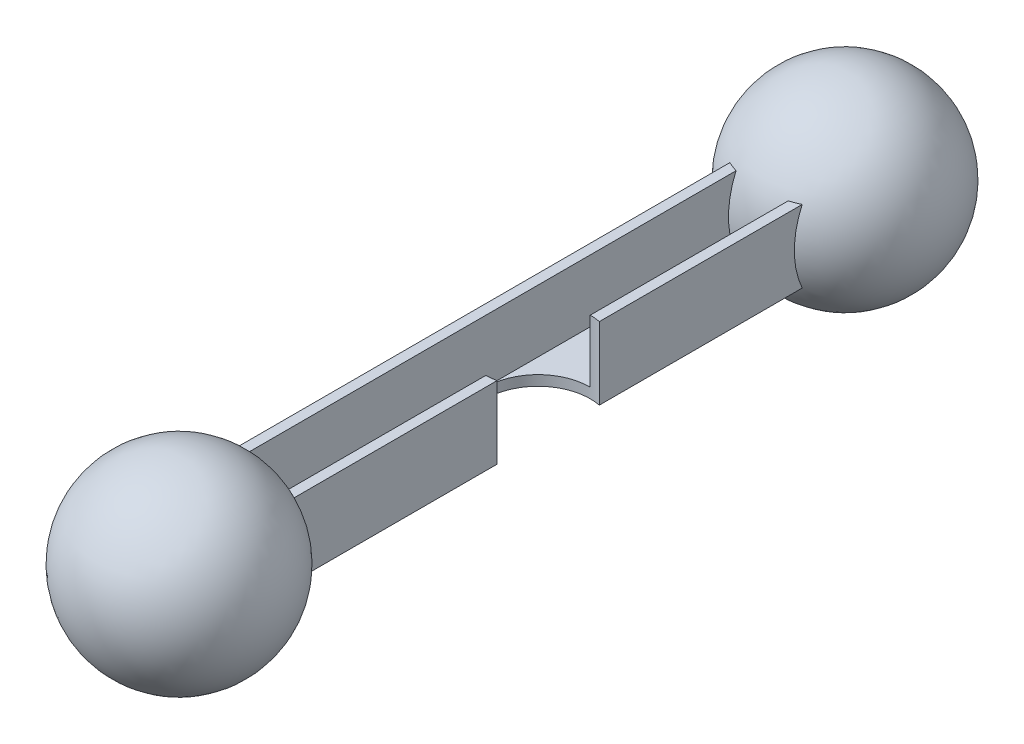
ISO-10303-21;
HEADER;
FILE_DESCRIPTION(('STEP AP214'),'2;1');
FILE_NAME('part.step','',(''),(''),'','','');
FILE_SCHEMA(('AUTOMOTIVE_DESIGN { 1 0 10303 214 1 1 1 1 }'));
ENDSEC;
DATA;
#1=APPLICATION_CONTEXT('core data for automotive mechanical design processes');
#2=APPLICATION_PROTOCOL_DEFINITION('international standard','automotive_design',2000,#1);
#3=PRODUCT_CONTEXT('',#1,'mechanical');
#4=PRODUCT('Part','Part','',(#3));
#5=PRODUCT_RELATED_PRODUCT_CATEGORY('part','',(#4));
#6=PRODUCT_DEFINITION_FORMATION('','',#4);
#7=PRODUCT_DEFINITION_CONTEXT('part definition',#1,'design');
#8=PRODUCT_DEFINITION('design','',#6,#7);
#9=PRODUCT_DEFINITION_SHAPE('','',#8);
#10=(LENGTH_UNIT() NAMED_UNIT(*) SI_UNIT(.MILLI.,.METRE.));
#11=(NAMED_UNIT(*) PLANE_ANGLE_UNIT() SI_UNIT($,.RADIAN.));
#12=(NAMED_UNIT(*) SI_UNIT($,.STERADIAN.) SOLID_ANGLE_UNIT());
#13=UNCERTAINTY_MEASURE_WITH_UNIT(LENGTH_MEASURE(1.E-05),#10,'distance_accuracy_value','');
#14=(GEOMETRIC_REPRESENTATION_CONTEXT(3) GLOBAL_UNCERTAINTY_ASSIGNED_CONTEXT((#13)) GLOBAL_UNIT_ASSIGNED_CONTEXT((#10,
#11,#12)) REPRESENTATION_CONTEXT('',''));
#15=CARTESIAN_POINT('',(0.,0.,0.));
#16=DIRECTION('',(0.,0.,1.));
#17=DIRECTION('',(1.,0.,0.));
#18=AXIS2_PLACEMENT_3D('',#15,#16,#17);
#19=CARTESIAN_POINT('',(12.5,12.5,115.));
#20=DIRECTION('',(1.,0.,0.));
#21=DIRECTION('',(0.,1.,0.));
#22=AXIS2_PLACEMENT_3D('',#19,#20,#21);
#23=PLANE('',#22);
#24=DIRECTION('',(0.,0.,-1.));
#25=VECTOR('',#24,1.);
#26=CARTESIAN_POINT('',(12.5,-12.5,115.));
#27=LINE('',#26,#25);
#28=CARTESIAN_POINT('',(12.5,-12.5,-17.6545901383723));
#29=VERTEX_POINT('',#28);
#30=CARTESIAN_POINT('',(12.5,-12.5,-87.7282197134107));
#31=VERTEX_POINT('',#30);
#32=EDGE_CURVE('E213',#29,#31,#27,.T.);
#33=ORIENTED_EDGE('',*,*,#32,.T.);
#34=CARTESIAN_POINT('',(12.5,0.,-115.));
#35=DIRECTION('',(1.,0.,0.));
#36=DIRECTION('',(0.,1.,0.));
#37=AXIS2_PLACEMENT_3D('',#34,#35,#36);
#38=CIRCLE('',#37,30.);
#39=CARTESIAN_POINT('',(12.5,12.5,-87.7282197134107));
#40=VERTEX_POINT('',#39);
#41=EDGE_CURVE('E231',#31,#40,#38,.F.);
#42=ORIENTED_EDGE('',*,*,#41,.T.);
#43=DIRECTION('',(0.,0.,-1.));
#44=VECTOR('',#43,1.);
#45=CARTESIAN_POINT('',(12.5,12.5,115.));
#46=LINE('',#45,#44);
#47=CARTESIAN_POINT('',(12.5,12.5,-17.6545901383723));
#48=VERTEX_POINT('',#47);
#49=EDGE_CURVE('E169',#48,#40,#46,.T.);
#50=ORIENTED_EDGE('',*,*,#49,.F.);
#51=DIRECTION('',(0.,1.,0.));
#52=VECTOR('',#51,1.);
#53=CARTESIAN_POINT('',(12.5,-12.5,-17.6545901383723));
#54=LINE('',#53,#52);
#55=EDGE_CURVE('E151',#29,#48,#54,.T.);
#56=ORIENTED_EDGE('',*,*,#55,.F.);
#57=EDGE_LOOP('',(#33,#42,#50,#56));
#58=FACE_BOUND('',#57,.T.);
#59=ADVANCED_FACE('F39',(#58),#23,.T.);
#60=CARTESIAN_POINT('',(9.00933712345874,12.5,115.));
#61=DIRECTION('',(0.,1.,0.));
#62=DIRECTION('',(0.,0.,1.));
#63=AXIS2_PLACEMENT_3D('',#60,#61,#62);
#64=PLANE('',#63);
#65=DIRECTION('',(0.,0.,-1.));
#66=VECTOR('',#65,1.);
#67=CARTESIAN_POINT('',(9.00933712345874,12.5,115.));
#68=LINE('',#67,#66);
#69=CARTESIAN_POINT('',(9.00933712345874,12.5,86.3847620209814));
#70=VERTEX_POINT('',#69);
#71=CARTESIAN_POINT('',(9.00933712345874,12.5,17.9999903131224));
#72=VERTEX_POINT('',#71);
#73=EDGE_CURVE('E160',#70,#72,#68,.T.);
#74=ORIENTED_EDGE('',*,*,#73,.F.);
#75=CARTESIAN_POINT('',(0.,12.5,115.));
#76=DIRECTION('',(0.,1.,0.));
#77=DIRECTION('',(0.,0.,1.));
#78=AXIS2_PLACEMENT_3D('',#75,#76,#77);
#79=CIRCLE('',#78,30.);
#80=CARTESIAN_POINT('',(12.5,12.5,87.7282197134107));
#81=VERTEX_POINT('',#80);
#82=EDGE_CURVE('E248',#70,#81,#79,.F.);
#83=ORIENTED_EDGE('',*,*,#82,.T.);
#84=CARTESIAN_POINT('',(12.5,12.5,17.6545901383723));
#85=VERTEX_POINT('',#84);
#86=EDGE_CURVE('E165',#81,#85,#46,.T.);
#87=ORIENTED_EDGE('',*,*,#86,.T.);
#88=CARTESIAN_POINT('',(8.99066287654125,12.5,0.));
#89=DIRECTION('',(0.,1.,0.));
#90=DIRECTION('',(-1.,0.,0.));
#91=AXIS2_PLACEMENT_3D('',#88,#89,#90);
#92=CIRCLE('',#91,18.);
#93=EDGE_CURVE('E175',#72,#85,#92,.T.);
#94=ORIENTED_EDGE('',*,*,#93,.F.);
#95=EDGE_LOOP('',(#74,#83,#87,#94));
#96=FACE_BOUND('',#95,.T.);
#97=ADVANCED_FACE('F268',(#96),#64,.T.);
#98=CARTESIAN_POINT('',(9.00933712345874,-9.00933712345874,115.));
#99=DIRECTION('',(-1.,0.,0.));
#100=DIRECTION('',(0.,-1.,0.));
#101=AXIS2_PLACEMENT_3D('',#98,#99,#100);
#102=PLANE('',#101);
#103=DIRECTION('',(0.,0.,-1.));
#104=VECTOR('',#103,1.);
#105=CARTESIAN_POINT('',(9.00933712345874,-9.00933712345874,115.));
#106=LINE('',#105,#104);
#107=CARTESIAN_POINT('',(9.00933712345874,-9.00933712345874,85.1016105920112));
#108=VERTEX_POINT('',#107);
#109=CARTESIAN_POINT('',(9.00933712345874,-9.00933712345874,17.9999903131224));
#110=VERTEX_POINT('',#109);
#111=EDGE_CURVE('E154',#108,#110,#106,.T.);
#112=ORIENTED_EDGE('',*,*,#111,.F.);
#113=CARTESIAN_POINT('',(9.00933712345874,0.,115.));
#114=DIRECTION('',(-1.,0.,0.));
#115=DIRECTION('',(0.,-1.,0.));
#116=AXIS2_PLACEMENT_3D('',#113,#114,#115);
#117=CIRCLE('',#116,31.2263005268935);
#118=EDGE_CURVE('E245',#108,#70,#117,.F.);
#119=ORIENTED_EDGE('',*,*,#118,.T.);
#120=ORIENTED_EDGE('',*,*,#73,.T.);
#121=DIRECTION('',(0.,1.,0.));
#122=VECTOR('',#121,1.);
#123=CARTESIAN_POINT('',(9.00933712345874,-12.5,17.9999903131224));
#124=LINE('',#123,#122);
#125=EDGE_CURVE('E161',#110,#72,#124,.T.);
#126=ORIENTED_EDGE('',*,*,#125,.F.);
#127=EDGE_LOOP('',(#112,#119,#120,#126));
#128=FACE_BOUND('',#127,.T.);
#129=ADVANCED_FACE('F266',(#128),#102,.T.);
#130=CARTESIAN_POINT('',(-9.00933712345875,-9.00933712345874,115.));
#131=DIRECTION('',(0.,1.,0.));
#132=DIRECTION('',(-1.,0.,0.));
#133=AXIS2_PLACEMENT_3D('',#130,#131,#132);
#134=PLANE('',#133);
#135=DIRECTION('',(0.,0.,-1.));
#136=VECTOR('',#135,1.);
#137=CARTESIAN_POINT('',(-9.00933712345875,-9.00933712345874,115.));
#138=LINE('',#137,#136);
#139=CARTESIAN_POINT('',(-9.00933712345875,-9.00933712345874,85.1016105920112));
#140=VERTEX_POINT('',#139);
#141=CARTESIAN_POINT('',(-9.00933712345875,-9.00933712345874,0.));
#142=VERTEX_POINT('',#141);
#143=EDGE_CURVE('E147',#140,#142,#138,.T.);
#144=ORIENTED_EDGE('',*,*,#143,.F.);
#145=CARTESIAN_POINT('',(0.,-9.00933712345874,115.));
#146=DIRECTION('',(0.,1.,0.));
#147=DIRECTION('',(-1.,0.,0.));
#148=AXIS2_PLACEMENT_3D('',#145,#146,#147);
#149=CIRCLE('',#148,31.2263005268935);
#150=EDGE_CURVE('E61',#140,#108,#149,.F.);
#151=ORIENTED_EDGE('',*,*,#150,.T.);
#152=ORIENTED_EDGE('',*,*,#111,.T.);
#153=CARTESIAN_POINT('',(8.99066287654125,-9.00933712345874,0.));
#154=DIRECTION('',(0.,1.,0.));
#155=DIRECTION('',(-1.,0.,0.));
#156=AXIS2_PLACEMENT_3D('',#153,#154,#155);
#157=CIRCLE('',#156,18.);
#158=EDGE_CURVE('E199',#142,#110,#157,.T.);
#159=ORIENTED_EDGE('',*,*,#158,.F.);
#160=EDGE_LOOP('',(#144,#151,#152,#159));
#161=FACE_BOUND('',#160,.T.);
#162=ADVANCED_FACE('F263',(#161),#134,.T.);
#163=CARTESIAN_POINT('',(-12.5,12.5,115.));
#164=DIRECTION('',(0.,1.,0.));
#165=DIRECTION('',(0.,0.,1.));
#166=AXIS2_PLACEMENT_3D('',#163,#164,#165);
#167=PLANE('',#166);
#168=DIRECTION('',(0.,0.,-1.));
#169=VECTOR('',#168,1.);
#170=CARTESIAN_POINT('',(-9.00933712345875,12.5,115.));
#171=LINE('',#170,#169);
#172=CARTESIAN_POINT('',(-9.00933712345875,12.5,86.3847620209814));
#173=VERTEX_POINT('',#172);
#174=CARTESIAN_POINT('',(-9.00933712345875,12.5,-86.3847620209814));
#175=VERTEX_POINT('',#174);
#176=EDGE_CURVE('E149',#173,#175,#171,.T.);
#177=ORIENTED_EDGE('',*,*,#176,.T.);
#178=CARTESIAN_POINT('',(0.,12.5,-115.));
#179=DIRECTION('',(0.,1.,0.));
#180=DIRECTION('',(0.,0.,1.));
#181=AXIS2_PLACEMENT_3D('',#178,#179,#180);
#182=CIRCLE('',#181,30.);
#183=CARTESIAN_POINT('',(-12.5,12.5,-87.7282197134107));
#184=VERTEX_POINT('',#183);
#185=EDGE_CURVE('E54',#175,#184,#182,.F.);
#186=ORIENTED_EDGE('',*,*,#185,.T.);
#187=DIRECTION('',(0.,0.,-1.));
#188=VECTOR('',#187,1.);
#189=CARTESIAN_POINT('',(-12.5,12.5,115.));
#190=LINE('',#189,#188);
#191=CARTESIAN_POINT('',(-12.5,12.5,87.7282197134107));
#192=VERTEX_POINT('',#191);
#193=EDGE_CURVE('E171',#192,#184,#190,.T.);
#194=ORIENTED_EDGE('',*,*,#193,.F.);
#195=CARTESIAN_POINT('',(0.,12.5,115.));
#196=DIRECTION('',(0.,1.,0.));
#197=DIRECTION('',(0.,0.,1.));
#198=AXIS2_PLACEMENT_3D('',#195,#196,#197);
#199=CIRCLE('',#198,30.);
#200=EDGE_CURVE('E241',#192,#173,#199,.F.);
#201=ORIENTED_EDGE('',*,*,#200,.T.);
#202=EDGE_LOOP('',(#177,#186,#194,#201));
#203=FACE_BOUND('',#202,.T.);
#204=ADVANCED_FACE('F41',(#203),#167,.T.);
#205=CARTESIAN_POINT('',(-12.5,12.5,115.));
#206=DIRECTION('',(1.,0.,0.));
#207=DIRECTION('',(0.,1.,0.));
#208=AXIS2_PLACEMENT_3D('',#205,#206,#207);
#209=PLANE('',#208);
#210=CARTESIAN_POINT('',(-12.5,0.,-115.));
#211=DIRECTION('',(1.,0.,0.));
#212=DIRECTION('',(0.,1.,0.));
#213=AXIS2_PLACEMENT_3D('',#210,#211,#212);
#214=CIRCLE('',#213,30.);
#215=CARTESIAN_POINT('',(-12.5,-12.5,-87.7282197134107));
#216=VERTEX_POINT('',#215);
#217=EDGE_CURVE('E235',#216,#184,#214,.F.);
#218=ORIENTED_EDGE('',*,*,#217,.F.);
#219=DIRECTION('',(0.,0.,-1.));
#220=VECTOR('',#219,1.);
#221=CARTESIAN_POINT('',(-12.5,-12.5,115.));
#222=LINE('',#221,#220);
#223=CARTESIAN_POINT('',(-12.5,-12.5,87.7282197134107));
#224=VERTEX_POINT('',#223);
#225=EDGE_CURVE('E210',#224,#216,#222,.T.);
#226=ORIENTED_EDGE('',*,*,#225,.F.);
#227=CARTESIAN_POINT('',(-12.5,0.,115.));
#228=DIRECTION('',(1.,0.,0.));
#229=DIRECTION('',(0.,1.,0.));
#230=AXIS2_PLACEMENT_3D('',#227,#228,#229);
#231=CIRCLE('',#230,30.);
#232=EDGE_CURVE('E176',#192,#224,#231,.F.);
#233=ORIENTED_EDGE('',*,*,#232,.F.);
#234=ORIENTED_EDGE('',*,*,#193,.T.);
#235=EDGE_LOOP('',(#218,#226,#233,#234));
#236=FACE_BOUND('',#235,.T.);
#237=ADVANCED_FACE('F260',(#236),#209,.F.);
#238=CARTESIAN_POINT('',(-12.5,-12.5,115.));
#239=DIRECTION('',(0.,1.,0.));
#240=DIRECTION('',(0.,0.,1.));
#241=AXIS2_PLACEMENT_3D('',#238,#239,#240);
#242=PLANE('',#241);
#243=CARTESIAN_POINT('',(0.,-12.5,-115.));
#244=DIRECTION('',(0.,1.,0.));
#245=DIRECTION('',(0.,0.,1.));
#246=AXIS2_PLACEMENT_3D('',#243,#244,#245);
#247=CIRCLE('',#246,30.);
#248=EDGE_CURVE('E233',#31,#216,#247,.F.);
#249=ORIENTED_EDGE('',*,*,#248,.F.);
#250=ORIENTED_EDGE('',*,*,#32,.F.);
#251=CARTESIAN_POINT('',(8.99066287654125,-12.5,0.));
#252=DIRECTION('',(0.,1.,0.));
#253=DIRECTION('',(-1.,0.,0.));
#254=AXIS2_PLACEMENT_3D('',#251,#252,#253);
#255=CIRCLE('',#254,18.);
#256=CARTESIAN_POINT('',(12.5,-12.5,17.6545901383723));
#257=VERTEX_POINT('',#256);
#258=EDGE_CURVE('E184',#29,#257,#255,.T.);
#259=ORIENTED_EDGE('',*,*,#258,.T.);
#260=CARTESIAN_POINT('',(12.5,-12.5,87.7282197134107));
#261=VERTEX_POINT('',#260);
#262=EDGE_CURVE('E212',#261,#257,#27,.T.);
#263=ORIENTED_EDGE('',*,*,#262,.F.);
#264=CARTESIAN_POINT('',(0.,-12.5,115.));
#265=DIRECTION('',(0.,1.,0.));
#266=DIRECTION('',(0.,0.,1.));
#267=AXIS2_PLACEMENT_3D('',#264,#265,#266);
#268=CIRCLE('',#267,30.);
#269=EDGE_CURVE('E251',#224,#261,#268,.F.);
#270=ORIENTED_EDGE('',*,*,#269,.F.);
#271=ORIENTED_EDGE('',*,*,#225,.T.);
#272=EDGE_LOOP('',(#249,#250,#259,#263,#270,#271));
#273=FACE_BOUND('',#272,.T.);
#274=ADVANCED_FACE('F258',(#273),#242,.F.);
#275=ORIENTED_EDGE('',*,*,#86,.F.);
#276=CARTESIAN_POINT('',(12.5,0.,115.));
#277=DIRECTION('',(1.,0.,0.));
#278=DIRECTION('',(0.,1.,0.));
#279=AXIS2_PLACEMENT_3D('',#276,#277,#278);
#280=CIRCLE('',#279,30.);
#281=EDGE_CURVE('E250',#81,#261,#280,.F.);
#282=ORIENTED_EDGE('',*,*,#281,.T.);
#283=ORIENTED_EDGE('',*,*,#262,.T.);
#284=DIRECTION('',(0.,1.,0.));
#285=VECTOR('',#284,1.);
#286=CARTESIAN_POINT('',(12.5,-12.5,17.6545901383723));
#287=LINE('',#286,#285);
#288=EDGE_CURVE('E203',#85,#257,#287,.F.);
#289=ORIENTED_EDGE('',*,*,#288,.F.);
#290=EDGE_LOOP('',(#275,#282,#283,#289));
#291=FACE_BOUND('',#290,.T.);
#292=ADVANCED_FACE('F269',(#291),#23,.T.);
#293=ORIENTED_EDGE('',*,*,#49,.T.);
#294=CARTESIAN_POINT('',(0.,12.5,-115.));
#295=DIRECTION('',(0.,1.,0.));
#296=DIRECTION('',(0.,0.,1.));
#297=AXIS2_PLACEMENT_3D('',#294,#295,#296);
#298=CIRCLE('',#297,30.);
#299=CARTESIAN_POINT('',(9.00933712345874,12.5,-86.3847620209814));
#300=VERTEX_POINT('',#299);
#301=EDGE_CURVE('E230',#40,#300,#298,.F.);
#302=ORIENTED_EDGE('',*,*,#301,.T.);
#303=CARTESIAN_POINT('',(9.00933712345874,12.5,-17.9999903131224));
#304=VERTEX_POINT('',#303);
#305=EDGE_CURVE('E157',#304,#300,#68,.T.);
#306=ORIENTED_EDGE('',*,*,#305,.F.);
#307=EDGE_CURVE('E172',#48,#304,#92,.T.);
#308=ORIENTED_EDGE('',*,*,#307,.F.);
#309=EDGE_LOOP('',(#293,#302,#306,#308));
#310=FACE_BOUND('',#309,.T.);
#311=ADVANCED_FACE('F228',(#310),#64,.T.);
#312=ORIENTED_EDGE('',*,*,#305,.T.);
#313=CARTESIAN_POINT('',(9.00933712345874,0.,-115.));
#314=DIRECTION('',(-1.,0.,0.));
#315=DIRECTION('',(0.,-1.,0.));
#316=AXIS2_PLACEMENT_3D('',#313,#314,#315);
#317=CIRCLE('',#316,31.2263005268935);
#318=CARTESIAN_POINT('',(9.00933712345874,-9.00933712345874,-85.1016105920112));
#319=VERTEX_POINT('',#318);
#320=EDGE_CURVE('E143',#300,#319,#317,.F.);
#321=ORIENTED_EDGE('',*,*,#320,.T.);
#322=CARTESIAN_POINT('',(9.00933712345874,-9.00933712345874,-17.9999903131224));
#323=VERTEX_POINT('',#322);
#324=EDGE_CURVE('E142',#323,#319,#106,.T.);
#325=ORIENTED_EDGE('',*,*,#324,.F.);
#326=DIRECTION('',(0.,1.,0.));
#327=VECTOR('',#326,1.);
#328=CARTESIAN_POINT('',(9.00933712345874,-12.5,-17.9999903131224));
#329=LINE('',#328,#327);
#330=EDGE_CURVE('E177',#304,#323,#329,.F.);
#331=ORIENTED_EDGE('',*,*,#330,.F.);
#332=EDGE_LOOP('',(#312,#321,#325,#331));
#333=FACE_BOUND('',#332,.T.);
#334=ADVANCED_FACE('F276',(#333),#102,.T.);
#335=ORIENTED_EDGE('',*,*,#324,.T.);
#336=CARTESIAN_POINT('',(0.,-9.00933712345874,-115.));
#337=DIRECTION('',(0.,1.,0.));
#338=DIRECTION('',(-1.,0.,0.));
#339=AXIS2_PLACEMENT_3D('',#336,#337,#338);
#340=CIRCLE('',#339,31.2263005268935);
#341=CARTESIAN_POINT('',(-9.00933712345875,-9.00933712345874,-85.1016105920112));
#342=VERTEX_POINT('',#341);
#343=EDGE_CURVE('E129',#319,#342,#340,.F.);
#344=ORIENTED_EDGE('',*,*,#343,.T.);
#345=EDGE_CURVE('E140',#142,#342,#138,.T.);
#346=ORIENTED_EDGE('',*,*,#345,.F.);
#347=EDGE_CURVE('E195',#323,#142,#157,.T.);
#348=ORIENTED_EDGE('',*,*,#347,.F.);
#349=EDGE_LOOP('',(#335,#344,#346,#348));
#350=FACE_BOUND('',#349,.T.);
#351=ADVANCED_FACE('F138',(#350),#134,.T.);
#352=CARTESIAN_POINT('',(-9.00933712345875,12.5,115.));
#353=DIRECTION('',(1.,0.,0.));
#354=DIRECTION('',(0.,0.,-1.));
#355=AXIS2_PLACEMENT_3D('',#352,#353,#354);
#356=PLANE('',#355);
#357=ORIENTED_EDGE('',*,*,#345,.T.);
#358=CARTESIAN_POINT('',(-9.00933712345875,0.,-115.));
#359=DIRECTION('',(1.,0.,0.));
#360=DIRECTION('',(0.,0.,-1.));
#361=AXIS2_PLACEMENT_3D('',#358,#359,#360);
#362=CIRCLE('',#361,31.2263005268935);
#363=EDGE_CURVE('E11',#342,#175,#362,.F.);
#364=ORIENTED_EDGE('',*,*,#363,.T.);
#365=ORIENTED_EDGE('',*,*,#176,.F.);
#366=CARTESIAN_POINT('',(-9.00933712345875,0.,115.));
#367=DIRECTION('',(1.,0.,0.));
#368=DIRECTION('',(0.,0.,-1.));
#369=AXIS2_PLACEMENT_3D('',#366,#367,#368);
#370=CIRCLE('',#369,31.2263005268935);
#371=EDGE_CURVE('E47',#173,#140,#370,.F.);
#372=ORIENTED_EDGE('',*,*,#371,.T.);
#373=ORIENTED_EDGE('',*,*,#143,.T.);
#374=EDGE_LOOP('',(#357,#364,#365,#372,#373));
#375=FACE_BOUND('',#374,.T.);
#376=ADVANCED_FACE('F145',(#375),#356,.T.);
#377=CARTESIAN_POINT('',(8.99066287654125,-12.5,0.));
#378=DIRECTION('',(0.,1.,0.));
#379=DIRECTION('',(-1.,0.,0.));
#380=AXIS2_PLACEMENT_3D('',#377,#378,#379);
#381=CYLINDRICAL_SURFACE('',#380,18.);
#382=ORIENTED_EDGE('',*,*,#55,.T.);
#383=ORIENTED_EDGE('',*,*,#307,.T.);
#384=ORIENTED_EDGE('',*,*,#330,.T.);
#385=ORIENTED_EDGE('',*,*,#347,.T.);
#386=ORIENTED_EDGE('',*,*,#158,.T.);
#387=ORIENTED_EDGE('',*,*,#125,.T.);
#388=ORIENTED_EDGE('',*,*,#93,.T.);
#389=ORIENTED_EDGE('',*,*,#288,.T.);
#390=ORIENTED_EDGE('',*,*,#258,.F.);
#391=EDGE_LOOP('',(#382,#383,#384,#385,#386,#387,#388,#389,#390));
#392=FACE_BOUND('',#391,.T.);
#393=ADVANCED_FACE('F292',(#392),#381,.F.);
#394=CARTESIAN_POINT('',(0.,0.,115.));
#395=DIRECTION('',(0.,1.,0.));
#396=DIRECTION('',(1.,0.,0.));
#397=AXIS2_PLACEMENT_3D('',#394,#395,#396);
#398=SPHERICAL_SURFACE('',#397,32.5);
#399=ORIENTED_EDGE('',*,*,#200,.F.);
#400=ORIENTED_EDGE('',*,*,#232,.T.);
#401=ORIENTED_EDGE('',*,*,#269,.T.);
#402=ORIENTED_EDGE('',*,*,#281,.F.);
#403=ORIENTED_EDGE('',*,*,#82,.F.);
#404=ORIENTED_EDGE('',*,*,#118,.F.);
#405=ORIENTED_EDGE('',*,*,#150,.F.);
#406=ORIENTED_EDGE('',*,*,#371,.F.);
#407=EDGE_LOOP('',(#399,#400,#401,#402,#403,#404,#405,#406));
#408=FACE_BOUND('',#407,.T.);
#409=ADVANCED_FACE('F254',(#408),#398,.T.);
#410=CARTESIAN_POINT('',(0.,0.,-115.));
#411=DIRECTION('',(0.,1.,0.));
#412=DIRECTION('',(1.,0.,0.));
#413=AXIS2_PLACEMENT_3D('',#410,#411,#412);
#414=SPHERICAL_SURFACE('',#413,32.5);
#415=ORIENTED_EDGE('',*,*,#248,.T.);
#416=ORIENTED_EDGE('',*,*,#217,.T.);
#417=ORIENTED_EDGE('',*,*,#185,.F.);
#418=ORIENTED_EDGE('',*,*,#363,.F.);
#419=ORIENTED_EDGE('',*,*,#343,.F.);
#420=ORIENTED_EDGE('',*,*,#320,.F.);
#421=ORIENTED_EDGE('',*,*,#301,.F.);
#422=ORIENTED_EDGE('',*,*,#41,.F.);
#423=EDGE_LOOP('',(#415,#416,#417,#418,#419,#420,#421,#422));
#424=FACE_BOUND('',#423,.T.);
#425=ADVANCED_FACE('F128',(#424),#414,.T.);
#426=CLOSED_SHELL('',(#59,#97,#129,#162,#204,#237,#274,#292,#311,#334,#351,#376,#393,#409,#425));
#427=MANIFOLD_SOLID_BREP('B2',#426);
#428=ADVANCED_BREP_SHAPE_REPRESENTATION('',(#18,#427),#14);
#429=SHAPE_DEFINITION_REPRESENTATION(#9,#428);
ENDSEC;
END-ISO-10303-21;
